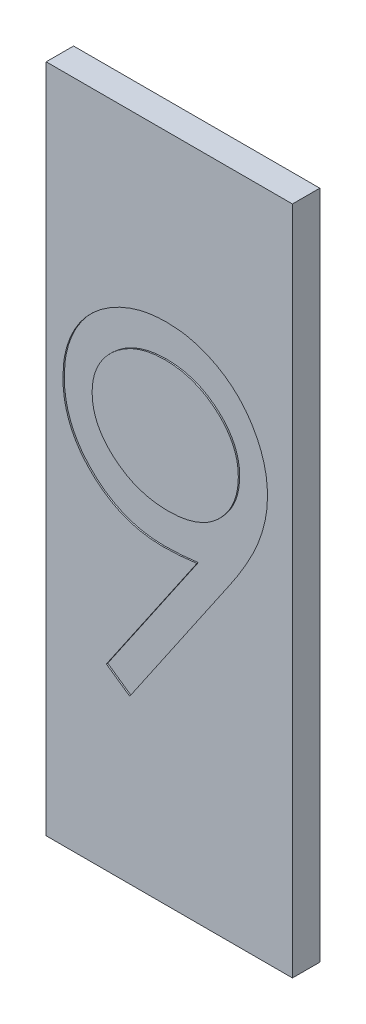
ISO-10303-21;
HEADER;
FILE_DESCRIPTION(('STEP AP214'),'2;1');
FILE_NAME('part.step','',(''),(''),'','','');
FILE_SCHEMA(('AUTOMOTIVE_DESIGN { 1 0 10303 214 1 1 1 1 }'));
ENDSEC;
DATA;
#1=APPLICATION_CONTEXT('core data for automotive mechanical design processes');
#2=APPLICATION_PROTOCOL_DEFINITION('international standard','automotive_design',2000,#1);
#3=PRODUCT_CONTEXT('',#1,'mechanical');
#4=PRODUCT('Part','Part','',(#3));
#5=PRODUCT_RELATED_PRODUCT_CATEGORY('part','',(#4));
#6=PRODUCT_DEFINITION_FORMATION('','',#4);
#7=PRODUCT_DEFINITION_CONTEXT('part definition',#1,'design');
#8=PRODUCT_DEFINITION('design','',#6,#7);
#9=PRODUCT_DEFINITION_SHAPE('','',#8);
#10=(LENGTH_UNIT() NAMED_UNIT(*) SI_UNIT(.MILLI.,.METRE.));
#11=(NAMED_UNIT(*) PLANE_ANGLE_UNIT() SI_UNIT($,.RADIAN.));
#12=(NAMED_UNIT(*) SI_UNIT($,.STERADIAN.) SOLID_ANGLE_UNIT());
#13=UNCERTAINTY_MEASURE_WITH_UNIT(LENGTH_MEASURE(1.E-05),#10,'distance_accuracy_value','');
#14=(GEOMETRIC_REPRESENTATION_CONTEXT(3) GLOBAL_UNCERTAINTY_ASSIGNED_CONTEXT((#13)) GLOBAL_UNIT_ASSIGNED_CONTEXT((#10,
#11,#12)) REPRESENTATION_CONTEXT('',''));
#15=CARTESIAN_POINT('',(0.,0.,0.));
#16=DIRECTION('',(0.,0.,1.));
#17=DIRECTION('',(1.,0.,0.));
#18=AXIS2_PLACEMENT_3D('',#15,#16,#17);
#19=CARTESIAN_POINT('',(0.,0.,2.));
#20=DIRECTION('',(0.,0.,1.));
#21=DIRECTION('',(1.,0.,0.));
#22=AXIS2_PLACEMENT_3D('',#19,#20,#21);
#23=PLANE('',#22);
#24=DIRECTION('',(0.,-1.,0.));
#25=VECTOR('',#24,1.);
#26=CARTESIAN_POINT('',(0.,0.,2.));
#27=LINE('',#26,#25);
#28=CARTESIAN_POINT('',(0.,49.,2.));
#29=VERTEX_POINT('',#28);
#30=CARTESIAN_POINT('',(0.,0.,2.));
#31=VERTEX_POINT('',#30);
#32=EDGE_CURVE('E282',#29,#31,#27,.T.);
#33=ORIENTED_EDGE('',*,*,#32,.T.);
#34=DIRECTION('',(1.,0.,0.));
#35=VECTOR('',#34,1.);
#36=CARTESIAN_POINT('',(18.,0.,2.));
#37=LINE('',#36,#35);
#38=CARTESIAN_POINT('',(18.,0.,2.));
#39=VERTEX_POINT('',#38);
#40=EDGE_CURVE('E285',#31,#39,#37,.T.);
#41=ORIENTED_EDGE('',*,*,#40,.T.);
#42=DIRECTION('',(0.,1.,0.));
#43=VECTOR('',#42,1.);
#44=CARTESIAN_POINT('',(18.,0.,2.));
#45=LINE('',#44,#43);
#46=CARTESIAN_POINT('',(18.,49.,2.));
#47=VERTEX_POINT('',#46);
#48=EDGE_CURVE('E288',#39,#47,#45,.T.);
#49=ORIENTED_EDGE('',*,*,#48,.T.);
#50=DIRECTION('',(-1.,0.,0.));
#51=VECTOR('',#50,1.);
#52=CARTESIAN_POINT('',(18.,49.,2.));
#53=LINE('',#52,#51);
#54=EDGE_CURVE('E290',#47,#29,#53,.T.);
#55=ORIENTED_EDGE('',*,*,#54,.T.);
#56=EDGE_LOOP('',(#33,#41,#49,#55));
#57=FACE_BOUND('',#56,.T.);
#58=CARTESIAN_POINT('',(16.1802884615385,29.6056941105769,2.));
#59=CARTESIAN_POINT('',(16.1722710723032,29.3557052661597,2.));
#60=CARTESIAN_POINT('',(16.156009803694,28.8486654269939,2.));
#61=CARTESIAN_POINT('',(16.0421431427276,28.0782947017078,2.));
#62=CARTESIAN_POINT('',(15.8487843826846,27.2928140153939,2.));
#63=CARTESIAN_POINT('',(15.6293576467429,26.6279581587378,2.));
#64=CARTESIAN_POINT('',(15.4175477202856,26.0788524557485,2.));
#65=CARTESIAN_POINT('',(15.2181953778545,25.645114027698,2.));
#66=CARTESIAN_POINT('',(14.9969966189874,25.1885857897114,2.));
#67=CARTESIAN_POINT('',(14.7390135895686,24.7140547942173,2.));
#68=CARTESIAN_POINT('',(14.461684392181,24.2154718331874,2.));
#69=CARTESIAN_POINT('',(14.1483168142711,23.697837641946,2.));
#70=CARTESIAN_POINT('',(13.8060592632779,23.1604575991892,2.));
#71=CARTESIAN_POINT('',(13.5622892059757,22.7981872323353,2.));
#72=CARTESIAN_POINT('',(13.4374624399038,22.6126802884615,2.));
#73=B_SPLINE_CURVE_WITH_KNOTS('',3,(#58,#59,#60,#61,#62,#63,#64,#65,#66,#67,#68,#69,#70,#71,
#72),.UNSPECIFIED.,.F.,.F.,(4,1,1,1,1,1,1,1,1,1,1,1,4),(0.,0.0983199739813471,0.199417473649668,
0.305602597602122,0.416162356355746,0.474582381314302,0.537006481233518,0.60385736064996,
0.674089607691874,0.749416986763792,0.82825348089081,0.912054159556053,1.),.UNSPECIFIED.);
#74=CARTESIAN_POINT('',(16.1802884615385,29.6056941105769,2.));
#75=VERTEX_POINT('',#74);
#76=CARTESIAN_POINT('',(13.4374624399038,22.6126802884615,2.));
#77=VERTEX_POINT('',#76);
#78=EDGE_CURVE('E254',#75,#77,#73,.T.);
#79=ORIENTED_EDGE('',*,*,#78,.T.);
#80=DIRECTION('',(-0.56440743436465,-0.825496364640035,0.));
#81=VECTOR('',#80,1.);
#82=CARTESIAN_POINT('',(13.4374624399038,22.6126802884615,2.));
#83=LINE('',#82,#81);
#84=CARTESIAN_POINT('',(6.10576923076923,11.8894230769231,2.));
#85=VERTEX_POINT('',#84);
#86=EDGE_CURVE('E48',#77,#85,#83,.T.);
#87=ORIENTED_EDGE('',*,*,#86,.T.);
#88=DIRECTION('',(-0.820951938640307,0.570997298104572,0.));
#89=VECTOR('',#88,1.);
#90=CARTESIAN_POINT('',(6.10576923076923,11.8894230769231,2.));
#91=LINE('',#90,#89);
#92=CARTESIAN_POINT('',(4.39806189903846,13.0771859975962,2.));
#93=VERTEX_POINT('',#92);
#94=EDGE_CURVE('E219',#85,#93,#91,.T.);
#95=ORIENTED_EDGE('',*,*,#94,.T.);
#96=DIRECTION('',(0.564610999945546,0.825357146174001,0.));
#97=VECTOR('',#96,1.);
#98=CARTESIAN_POINT('',(4.39806189903846,13.0771859975962,2.));
#99=LINE('',#98,#97);
#100=CARTESIAN_POINT('',(11.0190054086538,22.7557842548077,2.));
#101=VERTEX_POINT('',#100);
#102=EDGE_CURVE('E222',#93,#101,#99,.T.);
#103=ORIENTED_EDGE('',*,*,#102,.T.);
#104=CARTESIAN_POINT('',(11.0190054086538,22.7557842548077,2.));
#105=CARTESIAN_POINT('',(10.5965666539461,22.7041243061301,2.));
#106=CARTESIAN_POINT('',(9.76476119373004,22.6024029869906,2.));
#107=CARTESIAN_POINT('',(8.92698912427828,22.5837159254235,2.));
#108=CARTESIAN_POINT('',(8.51468599759616,22.5745192307692,2.));
#109=B_SPLINE_CURVE_WITH_KNOTS('',3,(#104,#105,#106,#107,#108),.UNSPECIFIED.,.F.,.F.,(4,1,4),
(0.,0.507857636084782,1.),.UNSPECIFIED.);
#110=CARTESIAN_POINT('',(8.51468599759616,22.5745192307692,2.));
#111=VERTEX_POINT('',#110);
#112=EDGE_CURVE('E225',#101,#111,#109,.T.);
#113=ORIENTED_EDGE('',*,*,#112,.T.);
#114=CARTESIAN_POINT('',(8.51468599759616,22.5745192307692,2.));
#115=CARTESIAN_POINT('',(8.26470885092438,22.5809219116985,2.));
#116=CARTESIAN_POINT('',(7.77402557197752,22.593489814462,2.));
#117=CARTESIAN_POINT('',(7.05263165015722,22.6931064030875,2.));
#118=CARTESIAN_POINT('',(6.35944596128278,22.8465278081036,2.));
#119=CARTESIAN_POINT('',(5.69630623625832,23.075459516578,2.));
#120=CARTESIAN_POINT('',(5.06071996207075,23.3599726887237,2.));
#121=CARTESIAN_POINT('',(4.45407466216267,23.7127855851378,2.));
#122=CARTESIAN_POINT('',(3.87718697853681,24.1278462474523,2.));
#123=CARTESIAN_POINT('',(3.33625263577882,24.6029599933916,2.));
#124=CARTESIAN_POINT('',(2.84427455510668,25.1246446004364,2.));
#125=CARTESIAN_POINT('',(2.4059660471136,25.6767928137997,2.));
#126=CARTESIAN_POINT('',(2.04169513142359,26.2658186142653,2.));
#127=CARTESIAN_POINT('',(1.7390955059714,26.8797063580111,2.));
#128=CARTESIAN_POINT('',(1.50960795570085,27.5272794771853,2.));
#129=CARTESIAN_POINT('',(1.34249497673811,28.2011691460062,2.));
#130=CARTESIAN_POINT('',(1.2396089586094,28.9060983530712,2.));
#131=CARTESIAN_POINT('',(1.22736868365055,29.385921117768,2.));
#132=CARTESIAN_POINT('',(1.22115384615385,29.6295447716346,2.));
#133=B_SPLINE_CURVE_WITH_KNOTS('',3,(#114,#115,#116,#117,#118,#119,#120,#121,#122,#123,#124,
#125,#126,#127,#128,#129,#130,#131,#132),.UNSPECIFIED.,.F.,.F.,(4,1,1,1,1,1,1,1,1,1,1,1,1,1,1,1,
4),(0.,0.066294912801988,0.130131116481168,0.192862225172608,0.254360004204222,
0.315909846081327,0.377338139346353,0.440205262887928,0.504175131770896,0.56803363241327,
0.630227721766869,0.690861477407067,0.751421817648455,0.811465736740862,0.872750466796127,
0.935390734844466,1.),.UNSPECIFIED.);
#134=CARTESIAN_POINT('',(1.22115384615385,29.6295447716346,2.));
#135=VERTEX_POINT('',#134);
#136=EDGE_CURVE('E230',#111,#135,#133,.T.);
#137=ORIENTED_EDGE('',*,*,#136,.T.);
#138=CARTESIAN_POINT('',(1.22115384615385,29.6295447716346,2.));
#139=CARTESIAN_POINT('',(1.23295419710314,29.9627064981754,2.));
#140=CARTESIAN_POINT('',(1.25611589221238,30.6166353826096,2.));
#141=CARTESIAN_POINT('',(1.44252366143025,31.5720865609943,2.));
#142=CARTESIAN_POINT('',(1.74909489774522,32.4755092952494,2.));
#143=CARTESIAN_POINT('',(2.17655224680987,33.3245282931901,2.));
#144=CARTESIAN_POINT('',(2.71495097654141,34.1069304296688,2.));
#145=CARTESIAN_POINT('',(3.36202906316126,34.8118390024216,2.));
#146=CARTESIAN_POINT('',(4.11385067732807,35.42922809734,2.));
#147=CARTESIAN_POINT('',(4.95328905745801,35.9599344097621,2.));
#148=CARTESIAN_POINT('',(5.86056585946546,36.3867564447482,2.));
#149=CARTESIAN_POINT('',(6.8108115510297,36.7013488284183,2.));
#150=CARTESIAN_POINT('',(7.79674511793427,36.8863974522937,2.));
#151=CARTESIAN_POINT('',(8.46463587378312,36.9107941145853,2.));
#152=CARTESIAN_POINT('',(8.80089393028846,36.9230769230769,2.));
#153=B_SPLINE_CURVE_WITH_KNOTS('',3,(#138,#139,#140,#141,#142,#143,#144,#145,#146,#147,#148,
#149,#150,#151,#152),.UNSPECIFIED.,.F.,.F.,(4,1,1,1,1,1,1,1,1,1,1,1,4),(0.,0.0852490510097896,
0.167326593617821,0.248175324580851,0.328829078311602,0.409908096976769,0.490584451140796,
0.57299348718939,0.658264892488035,0.744221577307991,0.82906040699134,0.913938297810617,1.),.UNSPECIFIED.);
#154=CARTESIAN_POINT('',(8.80089393028846,36.9230769230769,2.));
#155=VERTEX_POINT('',#154);
#156=EDGE_CURVE('E238',#135,#155,#153,.T.);
#157=ORIENTED_EDGE('',*,*,#156,.T.);
#158=CARTESIAN_POINT('',(8.80089393028846,36.9230769230769,2.));
#159=CARTESIAN_POINT('',(9.13078835646244,36.9106252779937,2.));
#160=CARTESIAN_POINT('',(9.7826286481837,36.8860220009466,2.));
#161=CARTESIAN_POINT('',(10.7411770678918,36.7058364256136,2.));
#162=CARTESIAN_POINT('',(11.6592579153181,36.4021476338523,2.));
#163=CARTESIAN_POINT('',(12.5317818426308,35.9824722983923,2.));
#164=CARTESIAN_POINT('',(13.3396339151321,35.4564139798761,2.));
#165=CARTESIAN_POINT('',(14.0660907735046,34.8295701666475,2.));
#166=CARTESIAN_POINT('',(14.6945743519868,34.1015504189011,2.));
#167=CARTESIAN_POINT('',(15.2240546834216,33.2899626562687,2.));
#168=CARTESIAN_POINT('',(15.6490740646802,32.4179694449235,2.));
#169=CARTESIAN_POINT('',(15.9557265614253,31.5077609721887,2.));
#170=CARTESIAN_POINT('',(16.1444959981539,30.5658832433786,2.));
#171=CARTESIAN_POINT('',(16.1682835092686,29.9277458393316,2.));
#172=CARTESIAN_POINT('',(16.1802884615385,29.6056941105769,2.));
#173=B_SPLINE_CURVE_WITH_KNOTS('',3,(#158,#159,#160,#161,#162,#163,#164,#165,#166,#167,#168,
#169,#170,#171,#172),.UNSPECIFIED.,.F.,.F.,(4,1,1,1,1,1,1,1,1,1,1,1,4),(0.,0.0855321076772636,
0.169003382889767,0.251943248891639,0.335682010401451,0.419408585819298,0.501264898481744,
0.583702941604284,0.668000359044251,0.751918659862066,0.834597711258477,0.916525668780153,1.),.UNSPECIFIED.);
#174=EDGE_CURVE('E246',#155,#75,#173,.T.);
#175=ORIENTED_EDGE('',*,*,#174,.T.);
#176=EDGE_LOOP('',(#79,#87,#95,#103,#113,#137,#157,#175));
#177=FACE_BOUND('',#176,.T.);
#178=ADVANCED_FACE('F33',(#57,#177),#23,.T.);
#179=CARTESIAN_POINT('',(0.,0.,2.));
#180=DIRECTION('',(1.,0.,0.));
#181=DIRECTION('',(0.,0.,-1.));
#182=AXIS2_PLACEMENT_3D('',#179,#180,#181);
#183=PLANE('',#182);
#184=DIRECTION('',(0.,-1.,0.));
#185=VECTOR('',#184,1.);
#186=CARTESIAN_POINT('',(0.,0.,0.));
#187=LINE('',#186,#185);
#188=CARTESIAN_POINT('',(0.,49.,0.));
#189=VERTEX_POINT('',#188);
#190=CARTESIAN_POINT('',(0.,0.,0.));
#191=VERTEX_POINT('',#190);
#192=EDGE_CURVE('E281',#189,#191,#187,.T.);
#193=ORIENTED_EDGE('',*,*,#192,.T.);
#194=DIRECTION('',(0.,0.,-1.));
#195=VECTOR('',#194,1.);
#196=CARTESIAN_POINT('',(0.,0.,2.));
#197=LINE('',#196,#195);
#198=EDGE_CURVE('E11',#31,#191,#197,.T.);
#199=ORIENTED_EDGE('',*,*,#198,.F.);
#200=ORIENTED_EDGE('',*,*,#32,.F.);
#201=DIRECTION('',(0.,0.,-1.));
#202=VECTOR('',#201,1.);
#203=CARTESIAN_POINT('',(0.,49.,2.));
#204=LINE('',#203,#202);
#205=EDGE_CURVE('E292',#29,#189,#204,.T.);
#206=ORIENTED_EDGE('',*,*,#205,.T.);
#207=EDGE_LOOP('',(#193,#199,#200,#206));
#208=FACE_BOUND('',#207,.T.);
#209=ADVANCED_FACE('F35',(#208),#183,.F.);
#210=CARTESIAN_POINT('',(18.,0.,2.));
#211=DIRECTION('',(0.,1.,0.));
#212=DIRECTION('',(0.,0.,1.));
#213=AXIS2_PLACEMENT_3D('',#210,#211,#212);
#214=PLANE('',#213);
#215=DIRECTION('',(1.,0.,0.));
#216=VECTOR('',#215,1.);
#217=CARTESIAN_POINT('',(18.,0.,0.));
#218=LINE('',#217,#216);
#219=CARTESIAN_POINT('',(18.,0.,0.));
#220=VERTEX_POINT('',#219);
#221=EDGE_CURVE('E295',#191,#220,#218,.T.);
#222=ORIENTED_EDGE('',*,*,#221,.T.);
#223=DIRECTION('',(0.,0.,-1.));
#224=VECTOR('',#223,1.);
#225=CARTESIAN_POINT('',(18.,0.,2.));
#226=LINE('',#225,#224);
#227=EDGE_CURVE('E41',#39,#220,#226,.T.);
#228=ORIENTED_EDGE('',*,*,#227,.F.);
#229=ORIENTED_EDGE('',*,*,#40,.F.);
#230=ORIENTED_EDGE('',*,*,#198,.T.);
#231=EDGE_LOOP('',(#222,#228,#229,#230));
#232=FACE_BOUND('',#231,.T.);
#233=ADVANCED_FACE('F325',(#232),#214,.F.);
#234=CARTESIAN_POINT('',(18.,0.,2.));
#235=DIRECTION('',(-1.,0.,0.));
#236=DIRECTION('',(0.,0.,1.));
#237=AXIS2_PLACEMENT_3D('',#234,#235,#236);
#238=PLANE('',#237);
#239=DIRECTION('',(0.,1.,0.));
#240=VECTOR('',#239,1.);
#241=CARTESIAN_POINT('',(18.,0.,0.));
#242=LINE('',#241,#240);
#243=CARTESIAN_POINT('',(18.,49.,0.));
#244=VERTEX_POINT('',#243);
#245=EDGE_CURVE('E297',#220,#244,#242,.T.);
#246=ORIENTED_EDGE('',*,*,#245,.T.);
#247=DIRECTION('',(0.,0.,-1.));
#248=VECTOR('',#247,1.);
#249=CARTESIAN_POINT('',(18.,49.,2.));
#250=LINE('',#249,#248);
#251=EDGE_CURVE('E302',#47,#244,#250,.T.);
#252=ORIENTED_EDGE('',*,*,#251,.F.);
#253=ORIENTED_EDGE('',*,*,#48,.F.);
#254=ORIENTED_EDGE('',*,*,#227,.T.);
#255=EDGE_LOOP('',(#246,#252,#253,#254));
#256=FACE_BOUND('',#255,.T.);
#257=ADVANCED_FACE('F309',(#256),#238,.F.);
#258=CARTESIAN_POINT('',(18.,49.,2.));
#259=DIRECTION('',(0.,-1.,0.));
#260=DIRECTION('',(0.,0.,-1.));
#261=AXIS2_PLACEMENT_3D('',#258,#259,#260);
#262=PLANE('',#261);
#263=DIRECTION('',(-1.,0.,0.));
#264=VECTOR('',#263,1.);
#265=CARTESIAN_POINT('',(18.,49.,0.));
#266=LINE('',#265,#264);
#267=EDGE_CURVE('E286',#244,#189,#266,.T.);
#268=ORIENTED_EDGE('',*,*,#267,.T.);
#269=ORIENTED_EDGE('',*,*,#205,.F.);
#270=ORIENTED_EDGE('',*,*,#54,.F.);
#271=ORIENTED_EDGE('',*,*,#251,.T.);
#272=EDGE_LOOP('',(#268,#269,#270,#271));
#273=FACE_BOUND('',#272,.T.);
#274=ADVANCED_FACE('F318',(#273),#262,.F.);
#275=CARTESIAN_POINT('',(0.,0.,0.));
#276=DIRECTION('',(0.,0.,1.));
#277=DIRECTION('',(1.,0.,0.));
#278=AXIS2_PLACEMENT_3D('',#275,#276,#277);
#279=PLANE('',#278);
#280=ORIENTED_EDGE('',*,*,#192,.F.);
#281=ORIENTED_EDGE('',*,*,#267,.F.);
#282=ORIENTED_EDGE('',*,*,#245,.F.);
#283=ORIENTED_EDGE('',*,*,#221,.F.);
#284=EDGE_LOOP('',(#280,#281,#282,#283));
#285=FACE_BOUND('',#284,.T.);
#286=ADVANCED_FACE('F315',(#285),#279,.F.);
#287=CARTESIAN_POINT('',(13.4374624399038,22.6126802884615,1.9));
#288=DIRECTION('',(-0.825496364640035,0.56440743436465,0.));
#289=DIRECTION('',(-0.56440743436465,-0.825496364640035,0.));
#290=AXIS2_PLACEMENT_3D('',#287,#288,#289);
#291=PLANE('',#290);
#292=ORIENTED_EDGE('',*,*,#86,.F.);
#293=DIRECTION('',(0.,0.,1.));
#294=VECTOR('',#293,1.);
#295=CARTESIAN_POINT('',(13.4374624399038,22.6126802884615,1.9));
#296=LINE('',#295,#294);
#297=CARTESIAN_POINT('',(13.4374624399038,22.6126802884615,1.9));
#298=VERTEX_POINT('',#297);
#299=EDGE_CURVE('E209',#298,#77,#296,.T.);
#300=ORIENTED_EDGE('',*,*,#299,.F.);
#301=DIRECTION('',(-0.56440743436465,-0.825496364640035,0.));
#302=VECTOR('',#301,1.);
#303=CARTESIAN_POINT('',(13.4374624399038,22.6126802884615,1.9));
#304=LINE('',#303,#302);
#305=CARTESIAN_POINT('',(6.10576923076923,11.8894230769231,1.9));
#306=VERTEX_POINT('',#305);
#307=EDGE_CURVE('E262',#298,#306,#304,.T.);
#308=ORIENTED_EDGE('',*,*,#307,.T.);
#309=DIRECTION('',(0.,0.,1.));
#310=VECTOR('',#309,1.);
#311=CARTESIAN_POINT('',(6.10576923076923,11.8894230769231,1.9));
#312=LINE('',#311,#310);
#313=EDGE_CURVE('E279',#306,#85,#312,.T.);
#314=ORIENTED_EDGE('',*,*,#313,.T.);
#315=EDGE_LOOP('',(#292,#300,#308,#314));
#316=FACE_BOUND('',#315,.T.);
#317=ADVANCED_FACE('F411',(#316),#291,.T.);
#318=CARTESIAN_POINT('',(6.10576923076923,11.8894230769231,1.9));
#319=DIRECTION('',(0.570997298104572,0.820951938640307,0.));
#320=DIRECTION('',(-0.820951938640307,0.570997298104572,0.));
#321=AXIS2_PLACEMENT_3D('',#318,#319,#320);
#322=PLANE('',#321);
#323=ORIENTED_EDGE('',*,*,#94,.F.);
#324=ORIENTED_EDGE('',*,*,#313,.F.);
#325=DIRECTION('',(-0.820951938640307,0.570997298104572,0.));
#326=VECTOR('',#325,1.);
#327=CARTESIAN_POINT('',(6.10576923076923,11.8894230769231,1.9));
#328=LINE('',#327,#326);
#329=CARTESIAN_POINT('',(4.39806189903846,13.0771859975962,1.9));
#330=VERTEX_POINT('',#329);
#331=EDGE_CURVE('E382',#306,#330,#328,.T.);
#332=ORIENTED_EDGE('',*,*,#331,.T.);
#333=DIRECTION('',(0.,0.,1.));
#334=VECTOR('',#333,1.);
#335=CARTESIAN_POINT('',(4.39806189903846,13.0771859975962,1.9));
#336=LINE('',#335,#334);
#337=EDGE_CURVE('E277',#330,#93,#336,.T.);
#338=ORIENTED_EDGE('',*,*,#337,.T.);
#339=EDGE_LOOP('',(#323,#324,#332,#338));
#340=FACE_BOUND('',#339,.T.);
#341=ADVANCED_FACE('F408',(#340),#322,.T.);
#342=CARTESIAN_POINT('',(4.39806189903846,13.0771859975962,1.9));
#343=DIRECTION('',(0.825357146174001,-0.564610999945546,0.));
#344=DIRECTION('',(0.564610999945546,0.825357146174001,0.));
#345=AXIS2_PLACEMENT_3D('',#342,#343,#344);
#346=PLANE('',#345);
#347=ORIENTED_EDGE('',*,*,#102,.F.);
#348=ORIENTED_EDGE('',*,*,#337,.F.);
#349=DIRECTION('',(0.564610999945546,0.825357146174001,0.));
#350=VECTOR('',#349,1.);
#351=CARTESIAN_POINT('',(4.39806189903846,13.0771859975962,1.9));
#352=LINE('',#351,#350);
#353=CARTESIAN_POINT('',(11.0190054086538,22.7557842548077,1.9));
#354=VERTEX_POINT('',#353);
#355=EDGE_CURVE('E384',#330,#354,#352,.T.);
#356=ORIENTED_EDGE('',*,*,#355,.T.);
#357=DIRECTION('',(0.,0.,1.));
#358=VECTOR('',#357,1.);
#359=CARTESIAN_POINT('',(11.0190054086538,22.7557842548077,1.9));
#360=LINE('',#359,#358);
#361=EDGE_CURVE('E275',#354,#101,#360,.T.);
#362=ORIENTED_EDGE('',*,*,#361,.T.);
#363=EDGE_LOOP('',(#347,#348,#356,#362));
#364=FACE_BOUND('',#363,.T.);
#365=ADVANCED_FACE('F404',(#364),#346,.T.);
#366=CARTESIAN_POINT('',(11.0190054086538,22.7557842548077,1.9));
#367=CARTESIAN_POINT('',(10.5965666539461,22.7041243061301,1.9));
#368=CARTESIAN_POINT('',(9.76476119373004,22.6024029869906,1.9));
#369=CARTESIAN_POINT('',(8.92698912427828,22.5837159254235,1.9));
#370=CARTESIAN_POINT('',(8.51468599759616,22.5745192307692,1.9));
#371=B_SPLINE_CURVE_WITH_KNOTS('',3,(#366,#367,#368,#369,#370),.UNSPECIFIED.,.F.,.F.,(4,1,4),
(0.,0.507857636084782,1.),.UNSPECIFIED.);
#372=DIRECTION('',(0.,0.,1.));
#373=VECTOR('',#372,1.);
#374=SURFACE_OF_LINEAR_EXTRUSION('',#371,#373);
#375=ORIENTED_EDGE('',*,*,#112,.F.);
#376=ORIENTED_EDGE('',*,*,#361,.F.);
#377=CARTESIAN_POINT('',(8.51468599759616,22.5745192307692,1.9));
#378=VERTEX_POINT('',#377);
#379=EDGE_CURVE('E386',#354,#378,#371,.T.);
#380=ORIENTED_EDGE('',*,*,#379,.T.);
#381=DIRECTION('',(0.,0.,1.));
#382=VECTOR('',#381,1.);
#383=CARTESIAN_POINT('',(8.51468599759616,22.5745192307692,1.9));
#384=LINE('',#383,#382);
#385=EDGE_CURVE('E273',#378,#111,#384,.T.);
#386=ORIENTED_EDGE('',*,*,#385,.T.);
#387=EDGE_LOOP('',(#375,#376,#380,#386));
#388=FACE_BOUND('',#387,.T.);
#389=ADVANCED_FACE('F399',(#388),#374,.T.);
#390=CARTESIAN_POINT('',(8.51468599759616,22.5745192307692,1.9));
#391=CARTESIAN_POINT('',(8.26470885092438,22.5809219116985,1.9));
#392=CARTESIAN_POINT('',(7.77402557197752,22.593489814462,1.9));
#393=CARTESIAN_POINT('',(7.05263165015722,22.6931064030875,1.9));
#394=CARTESIAN_POINT('',(6.35944596128278,22.8465278081036,1.9));
#395=CARTESIAN_POINT('',(5.69630623625832,23.075459516578,1.9));
#396=CARTESIAN_POINT('',(5.06071996207075,23.3599726887237,1.9));
#397=CARTESIAN_POINT('',(4.45407466216267,23.7127855851378,1.9));
#398=CARTESIAN_POINT('',(3.87718697853681,24.1278462474523,1.9));
#399=CARTESIAN_POINT('',(3.33625263577882,24.6029599933916,1.9));
#400=CARTESIAN_POINT('',(2.84427455510668,25.1246446004364,1.9));
#401=CARTESIAN_POINT('',(2.4059660471136,25.6767928137997,1.9));
#402=CARTESIAN_POINT('',(2.04169513142359,26.2658186142653,1.9));
#403=CARTESIAN_POINT('',(1.7390955059714,26.8797063580111,1.9));
#404=CARTESIAN_POINT('',(1.50960795570085,27.5272794771853,1.9));
#405=CARTESIAN_POINT('',(1.34249497673811,28.2011691460062,1.9));
#406=CARTESIAN_POINT('',(1.2396089586094,28.9060983530712,1.9));
#407=CARTESIAN_POINT('',(1.22736868365055,29.385921117768,1.9));
#408=CARTESIAN_POINT('',(1.22115384615385,29.6295447716346,1.9));
#409=B_SPLINE_CURVE_WITH_KNOTS('',3,(#390,#391,#392,#393,#394,#395,#396,#397,#398,#399,#400,
#401,#402,#403,#404,#405,#406,#407,#408),.UNSPECIFIED.,.F.,.F.,(4,1,1,1,1,1,1,1,1,1,1,1,1,1,1,1,
4),(0.,0.066294912801988,0.130131116481168,0.192862225172608,0.254360004204222,
0.315909846081327,0.377338139346353,0.440205262887928,0.504175131770896,0.56803363241327,
0.630227721766869,0.690861477407067,0.751421817648455,0.811465736740862,0.872750466796127,
0.935390734844466,1.),.UNSPECIFIED.);
#410=DIRECTION('',(0.,0.,1.));
#411=VECTOR('',#410,1.);
#412=SURFACE_OF_LINEAR_EXTRUSION('',#409,#411);
#413=ORIENTED_EDGE('',*,*,#136,.F.);
#414=ORIENTED_EDGE('',*,*,#385,.F.);
#415=CARTESIAN_POINT('',(1.22115384615385,29.6295447716346,1.9));
#416=VERTEX_POINT('',#415);
#417=EDGE_CURVE('E391',#378,#416,#409,.T.);
#418=ORIENTED_EDGE('',*,*,#417,.T.);
#419=DIRECTION('',(0.,0.,1.));
#420=VECTOR('',#419,1.);
#421=CARTESIAN_POINT('',(1.22115384615385,29.6295447716346,1.9));
#422=LINE('',#421,#420);
#423=EDGE_CURVE('E271',#416,#135,#422,.T.);
#424=ORIENTED_EDGE('',*,*,#423,.T.);
#425=EDGE_LOOP('',(#413,#414,#418,#424));
#426=FACE_BOUND('',#425,.T.);
#427=ADVANCED_FACE('F403',(#426),#412,.T.);
#428=CARTESIAN_POINT('',(1.22115384615385,29.6295447716346,1.9));
#429=CARTESIAN_POINT('',(1.23295419710314,29.9627064981754,1.9));
#430=CARTESIAN_POINT('',(1.25611589221238,30.6166353826096,1.9));
#431=CARTESIAN_POINT('',(1.44252366143025,31.5720865609943,1.9));
#432=CARTESIAN_POINT('',(1.74909489774522,32.4755092952494,1.9));
#433=CARTESIAN_POINT('',(2.17655224680987,33.3245282931901,1.9));
#434=CARTESIAN_POINT('',(2.71495097654141,34.1069304296688,1.9));
#435=CARTESIAN_POINT('',(3.36202906316126,34.8118390024216,1.9));
#436=CARTESIAN_POINT('',(4.11385067732807,35.42922809734,1.9));
#437=CARTESIAN_POINT('',(4.95328905745801,35.9599344097621,1.9));
#438=CARTESIAN_POINT('',(5.86056585946546,36.3867564447482,1.9));
#439=CARTESIAN_POINT('',(6.8108115510297,36.7013488284183,1.9));
#440=CARTESIAN_POINT('',(7.79674511793427,36.8863974522937,1.9));
#441=CARTESIAN_POINT('',(8.46463587378312,36.9107941145853,1.9));
#442=CARTESIAN_POINT('',(8.80089393028846,36.9230769230769,1.9));
#443=B_SPLINE_CURVE_WITH_KNOTS('',3,(#428,#429,#430,#431,#432,#433,#434,#435,#436,#437,#438,
#439,#440,#441,#442),.UNSPECIFIED.,.F.,.F.,(4,1,1,1,1,1,1,1,1,1,1,1,4),(0.,0.0852490510097896,
0.167326593617821,0.248175324580851,0.328829078311602,0.409908096976769,0.490584451140796,
0.57299348718939,0.658264892488035,0.744221577307991,0.82906040699134,0.913938297810617,1.),.UNSPECIFIED.);
#444=DIRECTION('',(0.,0.,1.));
#445=VECTOR('',#444,1.);
#446=SURFACE_OF_LINEAR_EXTRUSION('',#443,#445);
#447=ORIENTED_EDGE('',*,*,#156,.F.);
#448=ORIENTED_EDGE('',*,*,#423,.F.);
#449=CARTESIAN_POINT('',(8.80089393028846,36.9230769230769,1.9));
#450=VERTEX_POINT('',#449);
#451=EDGE_CURVE('E559',#416,#450,#443,.T.);
#452=ORIENTED_EDGE('',*,*,#451,.T.);
#453=DIRECTION('',(0.,0.,1.));
#454=VECTOR('',#453,1.);
#455=CARTESIAN_POINT('',(8.80089393028846,36.9230769230769,1.9));
#456=LINE('',#455,#454);
#457=EDGE_CURVE('E269',#450,#155,#456,.T.);
#458=ORIENTED_EDGE('',*,*,#457,.T.);
#459=EDGE_LOOP('',(#447,#448,#452,#458));
#460=FACE_BOUND('',#459,.T.);
#461=ADVANCED_FACE('F481',(#460),#446,.T.);
#462=CARTESIAN_POINT('',(8.80089393028846,36.9230769230769,1.9));
#463=CARTESIAN_POINT('',(9.13078835646244,36.9106252779937,1.9));
#464=CARTESIAN_POINT('',(9.7826286481837,36.8860220009466,1.9));
#465=CARTESIAN_POINT('',(10.7411770678918,36.7058364256136,1.9));
#466=CARTESIAN_POINT('',(11.6592579153181,36.4021476338523,1.9));
#467=CARTESIAN_POINT('',(12.5317818426308,35.9824722983923,1.9));
#468=CARTESIAN_POINT('',(13.3396339151321,35.4564139798761,1.9));
#469=CARTESIAN_POINT('',(14.0660907735046,34.8295701666475,1.9));
#470=CARTESIAN_POINT('',(14.6945743519868,34.1015504189011,1.9));
#471=CARTESIAN_POINT('',(15.2240546834216,33.2899626562687,1.9));
#472=CARTESIAN_POINT('',(15.6490740646802,32.4179694449235,1.9));
#473=CARTESIAN_POINT('',(15.9557265614253,31.5077609721887,1.9));
#474=CARTESIAN_POINT('',(16.1444959981539,30.5658832433786,1.9));
#475=CARTESIAN_POINT('',(16.1682835092686,29.9277458393316,1.9));
#476=CARTESIAN_POINT('',(16.1802884615385,29.6056941105769,1.9));
#477=B_SPLINE_CURVE_WITH_KNOTS('',3,(#462,#463,#464,#465,#466,#467,#468,#469,#470,#471,#472,
#473,#474,#475,#476),.UNSPECIFIED.,.F.,.F.,(4,1,1,1,1,1,1,1,1,1,1,1,4),(0.,0.0855321076772636,
0.169003382889767,0.251943248891639,0.335682010401451,0.419408585819298,0.501264898481744,
0.583702941604284,0.668000359044251,0.751918659862066,0.834597711258477,0.916525668780153,1.),.UNSPECIFIED.);
#478=DIRECTION('',(0.,0.,1.));
#479=VECTOR('',#478,1.);
#480=SURFACE_OF_LINEAR_EXTRUSION('',#477,#479);
#481=ORIENTED_EDGE('',*,*,#174,.F.);
#482=ORIENTED_EDGE('',*,*,#457,.F.);
#483=CARTESIAN_POINT('',(16.1802884615385,29.6056941105769,1.9));
#484=VERTEX_POINT('',#483);
#485=EDGE_CURVE('E210',#450,#484,#477,.T.);
#486=ORIENTED_EDGE('',*,*,#485,.T.);
#487=DIRECTION('',(0.,0.,1.));
#488=VECTOR('',#487,1.);
#489=CARTESIAN_POINT('',(16.1802884615385,29.6056941105769,1.9));
#490=LINE('',#489,#488);
#491=EDGE_CURVE('E267',#484,#75,#490,.T.);
#492=ORIENTED_EDGE('',*,*,#491,.T.);
#493=EDGE_LOOP('',(#481,#482,#486,#492));
#494=FACE_BOUND('',#493,.T.);
#495=ADVANCED_FACE('F200',(#494),#480,.T.);
#496=CARTESIAN_POINT('',(16.1802884615385,29.6056941105769,1.9));
#497=CARTESIAN_POINT('',(16.1722710723032,29.3557052661597,1.9));
#498=CARTESIAN_POINT('',(16.156009803694,28.8486654269939,1.9));
#499=CARTESIAN_POINT('',(16.0421431427276,28.0782947017078,1.9));
#500=CARTESIAN_POINT('',(15.8487843826846,27.2928140153939,1.9));
#501=CARTESIAN_POINT('',(15.6293576467429,26.6279581587378,1.9));
#502=CARTESIAN_POINT('',(15.4175477202856,26.0788524557485,1.9));
#503=CARTESIAN_POINT('',(15.2181953778545,25.645114027698,1.9));
#504=CARTESIAN_POINT('',(14.9969966189874,25.1885857897114,1.9));
#505=CARTESIAN_POINT('',(14.7390135895686,24.7140547942173,1.9));
#506=CARTESIAN_POINT('',(14.461684392181,24.2154718331874,1.9));
#507=CARTESIAN_POINT('',(14.1483168142711,23.697837641946,1.9));
#508=CARTESIAN_POINT('',(13.8060592632779,23.1604575991892,1.9));
#509=CARTESIAN_POINT('',(13.5622892059757,22.7981872323353,1.9));
#510=CARTESIAN_POINT('',(13.4374624399038,22.6126802884615,1.9));
#511=B_SPLINE_CURVE_WITH_KNOTS('',3,(#496,#497,#498,#499,#500,#501,#502,#503,#504,#505,#506,
#507,#508,#509,#510),.UNSPECIFIED.,.F.,.F.,(4,1,1,1,1,1,1,1,1,1,1,1,4),(0.,0.0983199739813471,
0.199417473649668,0.305602597602122,0.416162356355746,0.474582381314302,0.537006481233518,
0.60385736064996,0.674089607691874,0.749416986763792,0.82825348089081,0.912054159556053,1.),.UNSPECIFIED.);
#512=DIRECTION('',(0.,0.,1.));
#513=VECTOR('',#512,1.);
#514=SURFACE_OF_LINEAR_EXTRUSION('',#511,#513);
#515=ORIENTED_EDGE('',*,*,#78,.F.);
#516=ORIENTED_EDGE('',*,*,#491,.F.);
#517=EDGE_CURVE('E204',#484,#298,#511,.T.);
#518=ORIENTED_EDGE('',*,*,#517,.T.);
#519=ORIENTED_EDGE('',*,*,#299,.T.);
#520=EDGE_LOOP('',(#515,#516,#518,#519));
#521=FACE_BOUND('',#520,.T.);
#522=ADVANCED_FACE('F196',(#521),#514,.T.);
#523=CARTESIAN_POINT('',(9.76982864504963,22.6236396614188,1.9));
#524=DIRECTION('',(0.,0.,1.));
#525=DIRECTION('',(0.,-1.,0.));
#526=AXIS2_PLACEMENT_3D('',#523,#524,#525);
#527=PLANE('',#526);
#528=CARTESIAN_POINT('',(8.69118088942308,34.4807692307692,1.9));
#529=CARTESIAN_POINT('',(8.50976941744698,34.4754840009346,1.9));
#530=CARTESIAN_POINT('',(8.15384160348614,34.4651144235269,1.9));
#531=CARTESIAN_POINT('',(7.62953009019295,34.4042142597648,1.9));
#532=CARTESIAN_POINT('',(7.12701035898665,34.2930201975267,1.9));
#533=CARTESIAN_POINT('',(6.64299326390072,34.1404006885125,1.9));
#534=CARTESIAN_POINT('',(6.17838784395632,33.9436987457865,1.9));
#535=CARTESIAN_POINT('',(5.73362591100587,33.7054317169497,1.9));
#536=CARTESIAN_POINT('',(5.31129410082189,33.4212150905877,1.9));
#537=CARTESIAN_POINT('',(4.91547101832289,33.098761370863,1.9));
#538=CARTESIAN_POINT('',(4.54741194137297,32.7511829213095,1.9));
#539=CARTESIAN_POINT('',(4.23359361010298,32.371724413935,1.9));
#540=CARTESIAN_POINT('',(3.96421373736529,31.979515363524,1.9));
#541=CARTESIAN_POINT('',(3.74054630740462,31.569814441493,1.9));
#542=CARTESIAN_POINT('',(3.57043989524208,31.1399220341151,1.9));
#543=CARTESIAN_POINT('',(3.44374377703783,30.6929547636142,1.9));
#544=CARTESIAN_POINT('',(3.37170643844549,30.2265766765915,1.9));
#545=CARTESIAN_POINT('',(3.36272880919336,29.9096325732865,1.9));
#546=CARTESIAN_POINT('',(3.35817307692308,29.7487980769231,1.9));
#547=B_SPLINE_CURVE_WITH_KNOTS('',3,(#528,#529,#530,#531,#532,#533,#534,#535,#536,#537,#538,
#539,#540,#541,#542,#543,#544,#545,#546),.UNSPECIFIED.,.F.,.F.,(4,1,1,1,1,1,1,1,1,1,1,1,1,1,1,1,
4),(0.,0.0687118407239282,0.134812065608048,0.19953759260799,0.263334935107978,
0.326747480565382,0.390328483069277,0.454125825569265,0.519203321691314,0.58351014529212,
0.645497182764503,0.705289842311449,0.763487579584355,0.821856400128069,0.880004273206515,
0.939107709897902,1.),.UNSPECIFIED.);
#548=CARTESIAN_POINT('',(8.69118088942308,34.4807692307692,1.9));
#549=VERTEX_POINT('',#548);
#550=CARTESIAN_POINT('',(3.35817307692308,29.7487980769231,1.9));
#551=VERTEX_POINT('',#550);
#552=EDGE_CURVE('E160',#549,#551,#547,.T.);
#553=ORIENTED_EDGE('',*,*,#552,.F.);
#554=CARTESIAN_POINT('',(14.0432692307692,29.7487980769231,1.9));
#555=CARTESIAN_POINT('',(14.0387130887018,29.9096322277981,1.9));
#556=CARTESIAN_POINT('',(14.0297346518941,30.2265756502758,1.9));
#557=CARTESIAN_POINT('',(13.9577032020574,30.6929587019426,1.9));
#558=CARTESIAN_POINT('',(13.8309851661679,31.1399074942598,1.9));
#559=CARTESIAN_POINT('',(13.6609606185695,31.5698689193479,1.9));
#560=CARTESIAN_POINT('',(13.4369854289516,31.9793103778733,1.9));
#561=CARTESIAN_POINT('',(13.168220642082,32.373372362958,1.9));
#562=CARTESIAN_POINT('',(12.8489123676155,32.7495563036019,1.9));
#563=CARTESIAN_POINT('',(12.4815020514394,33.0990148348197,1.9));
#564=CARTESIAN_POINT('',(12.0852991104514,33.4211496492291,1.9));
#565=CARTESIAN_POINT('',(11.6630660642096,33.7054442016978,1.9));
#566=CARTESIAN_POINT('',(11.2182831533954,33.9437134128535,1.9));
#567=CARTESIAN_POINT('',(10.7536639277834,34.1403296184659,1.9));
#568=CARTESIAN_POINT('',(10.2682403396258,34.2937622351681,1.9));
#569=CARTESIAN_POINT('',(9.76229963409518,34.404098234151,1.9));
#570=CARTESIAN_POINT('',(9.2332851787134,34.4651382070282,1.9));
#571=CARTESIAN_POINT('',(8.87418392825361,34.4754925249745,1.9));
#572=CARTESIAN_POINT('',(8.69118088942308,34.4807692307692,1.9));
#573=B_SPLINE_CURVE_WITH_KNOTS('',3,(#554,#555,#556,#557,#558,#559,#560,#561,#562,#563,#564,
#565,#566,#567,#568,#569,#570,#571,#572),.UNSPECIFIED.,.F.,.F.,(4,1,1,1,1,1,1,1,1,1,1,1,1,1,1,1,
4),(0.,0.0607600970467264,0.11973522416286,0.177756862130216,0.235998967900792,
0.294070361810804,0.353733215526157,0.415972619584907,0.480139837408385,0.545076054675034,
0.608734897446805,0.672177869882024,0.735452750979641,0.799111593751411,0.864283666018102,
0.930837050815538,1.),.UNSPECIFIED.);
#574=CARTESIAN_POINT('',(14.0432692307692,29.7487980769231,1.9));
#575=VERTEX_POINT('',#574);
#576=EDGE_CURVE('E170',#575,#549,#573,.T.);
#577=ORIENTED_EDGE('',*,*,#576,.F.);
#578=CARTESIAN_POINT('',(8.91060697115385,25.0168269230769,1.9));
#579=CARTESIAN_POINT('',(9.09997767433444,25.022000248369,1.9));
#580=CARTESIAN_POINT('',(9.46861805516243,25.0320709539945,1.9));
#581=CARTESIAN_POINT('',(10.0086671788618,25.0933659747406,1.9));
#582=CARTESIAN_POINT('',(10.5184193486313,25.2020461301648,1.9));
#583=CARTESIAN_POINT('',(10.9992362412273,25.357982028162,1.9));
#584=CARTESIAN_POINT('',(11.455938913154,25.5461461506298,1.9));
#585=CARTESIAN_POINT('',(11.8812732175315,25.7857134130165,1.9));
#586=CARTESIAN_POINT('',(12.2755951222418,26.0715765899785,1.9));
#587=CARTESIAN_POINT('',(12.6415451259006,26.3927733036323,1.9));
#588=CARTESIAN_POINT('',(12.9665109099068,26.7496245953238,1.9));
#589=CARTESIAN_POINT('',(13.255955457955,27.1231209817175,1.9));
#590=CARTESIAN_POINT('',(13.5019764612952,27.5149019888283,1.9));
#591=CARTESIAN_POINT('',(13.6963087571476,27.929874005431,1.9));
#592=CARTESIAN_POINT('',(13.8560877438276,28.3579357273514,1.9));
#593=CARTESIAN_POINT('',(13.9664281472467,28.8059805369753,1.9));
#594=CARTESIAN_POINT('',(14.0275537002416,29.2716741201211,1.9));
#595=CARTESIAN_POINT('',(14.0379738795136,29.588031061182,1.9));
#596=CARTESIAN_POINT('',(14.0432692307692,29.7487980769231,1.9));
#597=B_SPLINE_CURVE_WITH_KNOTS('',3,(#578,#579,#580,#581,#582,#583,#584,#585,#586,#587,#588,
#589,#590,#591,#592,#593,#594,#595,#596),.UNSPECIFIED.,.F.,.F.,(4,1,1,1,1,1,1,1,1,1,1,1,1,1,1,1,
4),(0.,0.0727129966169393,0.141547484979501,0.208362522955952,0.272461583955704,
0.335389961487686,0.397711298679618,0.459383374947441,0.522098173887341,0.584314766747193,
0.644391935230053,0.703345013294786,0.761508874970189,0.820030474917232,0.8785170367553,
0.938264501487674,1.),.UNSPECIFIED.);
#598=CARTESIAN_POINT('',(8.91060697115385,25.0168269230769,1.9));
#599=VERTEX_POINT('',#598);
#600=EDGE_CURVE('E152',#599,#575,#597,.T.);
#601=ORIENTED_EDGE('',*,*,#600,.F.);
#602=CARTESIAN_POINT('',(3.35817307692308,29.7487980769231,1.9));
#603=CARTESIAN_POINT('',(3.36229553851825,29.5879058676998,1.9));
#604=CARTESIAN_POINT('',(3.37042578730919,29.2705969833574,1.9));
#605=CARTESIAN_POINT('',(3.44885592801435,28.8043727745821,1.9));
#606=CARTESIAN_POINT('',(3.58001708192605,28.3574584548207,1.9));
#607=CARTESIAN_POINT('',(3.75568115002554,27.9255085018917,1.9));
#608=CARTESIAN_POINT('',(3.98701339726076,27.5127231812211,1.9));
#609=CARTESIAN_POINT('',(4.27088457715359,27.1210595224797,1.9));
#610=CARTESIAN_POINT('',(4.60361695290184,26.7460776204143,1.9));
#611=CARTESIAN_POINT('',(4.98076264576813,26.3936035541304,1.9));
#612=CARTESIAN_POINT('',(5.39352281216929,26.0700789311622,1.9));
#613=CARTESIAN_POINT('',(5.83437210272621,25.7875240106495,1.9));
#614=CARTESIAN_POINT('',(6.29572117154986,25.548906129862,1.9));
#615=CARTESIAN_POINT('',(6.77919405249646,25.3574442142432,1.9));
#616=CARTESIAN_POINT('',(7.28120781587864,25.2036041467776,1.9));
#617=CARTESIAN_POINT('',(7.80627433482823,25.0935662757665,1.9));
#618=CARTESIAN_POINT('',(8.35265716463283,25.0326588895284,1.9));
#619=CARTESIAN_POINT('',(8.72283936254738,25.0221548763182,1.9));
#620=CARTESIAN_POINT('',(8.91060697115385,25.0168269230769,1.9));
#621=B_SPLINE_CURVE_WITH_KNOTS('',3,(#602,#603,#604,#605,#606,#607,#608,#609,#610,#611,#612,
#613,#614,#615,#616,#617,#618,#619,#620),.UNSPECIFIED.,.F.,.F.,(4,1,1,1,1,1,1,1,1,1,1,1,1,1,1,1,
4),(0.,0.0595395854970873,0.117422960002117,0.174440441046919,0.231733890556421,
0.289721977285957,0.349200396448603,0.410515531734449,0.475080278974362,0.540094475476167,
0.604444095929783,0.668696674340235,0.732110201101078,0.796739346741746,0.862905729709647,
0.930461639076418,1.),.UNSPECIFIED.);
#622=EDGE_CURVE('E167',#551,#599,#621,.T.);
#623=ORIENTED_EDGE('',*,*,#622,.F.);
#624=EDGE_LOOP('',(#553,#577,#601,#623));
#625=FACE_BOUND('',#624,.T.);
#626=ORIENTED_EDGE('',*,*,#307,.F.);
#627=ORIENTED_EDGE('',*,*,#517,.F.);
#628=ORIENTED_EDGE('',*,*,#485,.F.);
#629=ORIENTED_EDGE('',*,*,#451,.F.);
#630=ORIENTED_EDGE('',*,*,#417,.F.);
#631=ORIENTED_EDGE('',*,*,#379,.F.);
#632=ORIENTED_EDGE('',*,*,#355,.F.);
#633=ORIENTED_EDGE('',*,*,#331,.F.);
#634=EDGE_LOOP('',(#626,#627,#628,#629,#630,#631,#632,#633));
#635=FACE_BOUND('',#634,.T.);
#636=ADVANCED_FACE('F165',(#625,#635),#527,.T.);
#637=DIRECTION('',(0.,0.,1.));
#638=VECTOR('',#637,1.);
#639=SURFACE_OF_LINEAR_EXTRUSION('',#621,#638);
#640=CARTESIAN_POINT('',(3.35817307692308,29.7487980769231,2.));
#641=CARTESIAN_POINT('',(3.36229553851825,29.5879058676998,2.));
#642=CARTESIAN_POINT('',(3.37042578730919,29.2705969833574,2.));
#643=CARTESIAN_POINT('',(3.44885592801435,28.8043727745821,2.));
#644=CARTESIAN_POINT('',(3.58001708192605,28.3574584548207,2.));
#645=CARTESIAN_POINT('',(3.75568115002554,27.9255085018917,2.));
#646=CARTESIAN_POINT('',(3.98701339726076,27.5127231812211,2.));
#647=CARTESIAN_POINT('',(4.27088457715359,27.1210595224797,2.));
#648=CARTESIAN_POINT('',(4.60361695290184,26.7460776204143,2.));
#649=CARTESIAN_POINT('',(4.98076264576813,26.3936035541304,2.));
#650=CARTESIAN_POINT('',(5.39352281216929,26.0700789311622,2.));
#651=CARTESIAN_POINT('',(5.83437210272621,25.7875240106495,2.));
#652=CARTESIAN_POINT('',(6.29572117154986,25.548906129862,2.));
#653=CARTESIAN_POINT('',(6.77919405249646,25.3574442142432,2.));
#654=CARTESIAN_POINT('',(7.28120781587864,25.2036041467776,2.));
#655=CARTESIAN_POINT('',(7.80627433482823,25.0935662757665,2.));
#656=CARTESIAN_POINT('',(8.35265716463283,25.0326588895284,2.));
#657=CARTESIAN_POINT('',(8.72283936254738,25.0221548763182,2.));
#658=CARTESIAN_POINT('',(8.91060697115385,25.0168269230769,2.));
#659=B_SPLINE_CURVE_WITH_KNOTS('',3,(#640,#641,#642,#643,#644,#645,#646,#647,#648,#649,#650,
#651,#652,#653,#654,#655,#656,#657,#658),.UNSPECIFIED.,.F.,.F.,(4,1,1,1,1,1,1,1,1,1,1,1,1,1,1,1,
4),(0.,0.0595395854970873,0.117422960002117,0.174440441046919,0.231733890556421,
0.289721977285957,0.349200396448603,0.410515531734449,0.475080278974362,0.540094475476167,
0.604444095929783,0.668696674340235,0.732110201101078,0.796739346741746,0.862905729709647,
0.930461639076418,1.),.UNSPECIFIED.);
#660=CARTESIAN_POINT('',(3.35817307692308,29.7487980769231,2.));
#661=VERTEX_POINT('',#660);
#662=CARTESIAN_POINT('',(8.91060697115385,25.0168269230769,2.));
#663=VERTEX_POINT('',#662);
#664=EDGE_CURVE('E346',#661,#663,#659,.T.);
#665=ORIENTED_EDGE('',*,*,#664,.F.);
#666=DIRECTION('',(0.,0.,1.));
#667=VECTOR('',#666,1.);
#668=CARTESIAN_POINT('',(3.35817307692308,29.7487980769231,1.9));
#669=LINE('',#668,#667);
#670=EDGE_CURVE('E173',#551,#661,#669,.T.);
#671=ORIENTED_EDGE('',*,*,#670,.F.);
#672=ORIENTED_EDGE('',*,*,#622,.T.);
#673=DIRECTION('',(0.,0.,1.));
#674=VECTOR('',#673,1.);
#675=CARTESIAN_POINT('',(8.91060697115385,25.0168269230769,1.9));
#676=LINE('',#675,#674);
#677=EDGE_CURVE('E149',#599,#663,#676,.T.);
#678=ORIENTED_EDGE('',*,*,#677,.T.);
#679=EDGE_LOOP('',(#665,#671,#672,#678));
#680=FACE_BOUND('',#679,.T.);
#681=ADVANCED_FACE('F172',(#680),#639,.T.);
#682=DIRECTION('',(0.,0.,1.));
#683=VECTOR('',#682,1.);
#684=SURFACE_OF_LINEAR_EXTRUSION('',#547,#683);
#685=CARTESIAN_POINT('',(8.69118088942308,34.4807692307692,2.));
#686=CARTESIAN_POINT('',(8.50976941744698,34.4754840009346,2.));
#687=CARTESIAN_POINT('',(8.15384160348614,34.4651144235269,2.));
#688=CARTESIAN_POINT('',(7.62953009019295,34.4042142597648,2.));
#689=CARTESIAN_POINT('',(7.12701035898665,34.2930201975267,2.));
#690=CARTESIAN_POINT('',(6.64299326390072,34.1404006885125,2.));
#691=CARTESIAN_POINT('',(6.17838784395632,33.9436987457865,2.));
#692=CARTESIAN_POINT('',(5.73362591100587,33.7054317169497,2.));
#693=CARTESIAN_POINT('',(5.31129410082189,33.4212150905877,2.));
#694=CARTESIAN_POINT('',(4.91547101832289,33.098761370863,2.));
#695=CARTESIAN_POINT('',(4.54741194137297,32.7511829213095,2.));
#696=CARTESIAN_POINT('',(4.23359361010298,32.371724413935,2.));
#697=CARTESIAN_POINT('',(3.96421373736529,31.979515363524,2.));
#698=CARTESIAN_POINT('',(3.74054630740462,31.569814441493,2.));
#699=CARTESIAN_POINT('',(3.57043989524208,31.1399220341151,2.));
#700=CARTESIAN_POINT('',(3.44374377703783,30.6929547636142,2.));
#701=CARTESIAN_POINT('',(3.37170643844549,30.2265766765915,2.));
#702=CARTESIAN_POINT('',(3.36272880919336,29.9096325732865,2.));
#703=CARTESIAN_POINT('',(3.35817307692308,29.7487980769231,2.));
#704=B_SPLINE_CURVE_WITH_KNOTS('',3,(#685,#686,#687,#688,#689,#690,#691,#692,#693,#694,#695,
#696,#697,#698,#699,#700,#701,#702,#703),.UNSPECIFIED.,.F.,.F.,(4,1,1,1,1,1,1,1,1,1,1,1,1,1,1,1,
4),(0.,0.0687118407239282,0.134812065608048,0.19953759260799,0.263334935107978,
0.326747480565382,0.390328483069277,0.454125825569265,0.519203321691314,0.58351014529212,
0.645497182764503,0.705289842311449,0.763487579584355,0.821856400128069,0.880004273206515,
0.939107709897902,1.),.UNSPECIFIED.);
#705=CARTESIAN_POINT('',(8.69118088942308,34.4807692307692,2.));
#706=VERTEX_POINT('',#705);
#707=EDGE_CURVE('E174',#706,#661,#704,.T.);
#708=ORIENTED_EDGE('',*,*,#707,.F.);
#709=DIRECTION('',(0.,0.,1.));
#710=VECTOR('',#709,1.);
#711=CARTESIAN_POINT('',(8.69118088942308,34.4807692307692,1.9));
#712=LINE('',#711,#710);
#713=EDGE_CURVE('E348',#549,#706,#712,.T.);
#714=ORIENTED_EDGE('',*,*,#713,.F.);
#715=ORIENTED_EDGE('',*,*,#552,.T.);
#716=ORIENTED_EDGE('',*,*,#670,.T.);
#717=EDGE_LOOP('',(#708,#714,#715,#716));
#718=FACE_BOUND('',#717,.T.);
#719=ADVANCED_FACE('F192',(#718),#684,.T.);
#720=DIRECTION('',(0.,0.,1.));
#721=VECTOR('',#720,1.);
#722=SURFACE_OF_LINEAR_EXTRUSION('',#573,#721);
#723=CARTESIAN_POINT('',(14.0432692307692,29.7487980769231,2.));
#724=CARTESIAN_POINT('',(14.0387130887018,29.9096322277981,2.));
#725=CARTESIAN_POINT('',(14.0297346518941,30.2265756502758,2.));
#726=CARTESIAN_POINT('',(13.9577032020574,30.6929587019426,2.));
#727=CARTESIAN_POINT('',(13.8309851661679,31.1399074942598,2.));
#728=CARTESIAN_POINT('',(13.6609606185695,31.5698689193479,2.));
#729=CARTESIAN_POINT('',(13.4369854289516,31.9793103778733,2.));
#730=CARTESIAN_POINT('',(13.168220642082,32.373372362958,2.));
#731=CARTESIAN_POINT('',(12.8489123676155,32.7495563036019,2.));
#732=CARTESIAN_POINT('',(12.4815020514394,33.0990148348197,2.));
#733=CARTESIAN_POINT('',(12.0852991104514,33.4211496492291,2.));
#734=CARTESIAN_POINT('',(11.6630660642096,33.7054442016978,2.));
#735=CARTESIAN_POINT('',(11.2182831533954,33.9437134128535,2.));
#736=CARTESIAN_POINT('',(10.7536639277834,34.1403296184659,2.));
#737=CARTESIAN_POINT('',(10.2682403396258,34.2937622351681,2.));
#738=CARTESIAN_POINT('',(9.76229963409518,34.404098234151,2.));
#739=CARTESIAN_POINT('',(9.2332851787134,34.4651382070282,2.));
#740=CARTESIAN_POINT('',(8.87418392825361,34.4754925249745,2.));
#741=CARTESIAN_POINT('',(8.69118088942308,34.4807692307692,2.));
#742=B_SPLINE_CURVE_WITH_KNOTS('',3,(#723,#724,#725,#726,#727,#728,#729,#730,#731,#732,#733,
#734,#735,#736,#737,#738,#739,#740,#741),.UNSPECIFIED.,.F.,.F.,(4,1,1,1,1,1,1,1,1,1,1,1,1,1,1,1,
4),(0.,0.0607600970467264,0.11973522416286,0.177756862130216,0.235998967900792,
0.294070361810804,0.353733215526157,0.415972619584907,0.480139837408385,0.545076054675034,
0.608734897446805,0.672177869882024,0.735452750979641,0.799111593751411,0.864283666018102,
0.930837050815538,1.),.UNSPECIFIED.);
#743=CARTESIAN_POINT('',(14.0432692307692,29.7487980769231,2.));
#744=VERTEX_POINT('',#743);
#745=EDGE_CURVE('E56',#744,#706,#742,.T.);
#746=ORIENTED_EDGE('',*,*,#745,.F.);
#747=DIRECTION('',(0.,0.,1.));
#748=VECTOR('',#747,1.);
#749=CARTESIAN_POINT('',(14.0432692307692,29.7487980769231,1.9));
#750=LINE('',#749,#748);
#751=EDGE_CURVE('E159',#575,#744,#750,.T.);
#752=ORIENTED_EDGE('',*,*,#751,.F.);
#753=ORIENTED_EDGE('',*,*,#576,.T.);
#754=ORIENTED_EDGE('',*,*,#713,.T.);
#755=EDGE_LOOP('',(#746,#752,#753,#754));
#756=FACE_BOUND('',#755,.T.);
#757=ADVANCED_FACE('F344',(#756),#722,.T.);
#758=DIRECTION('',(0.,0.,1.));
#759=VECTOR('',#758,1.);
#760=SURFACE_OF_LINEAR_EXTRUSION('',#597,#759);
#761=CARTESIAN_POINT('',(8.91060697115385,25.0168269230769,2.));
#762=CARTESIAN_POINT('',(9.09997767433444,25.022000248369,2.));
#763=CARTESIAN_POINT('',(9.46861805516243,25.0320709539945,2.));
#764=CARTESIAN_POINT('',(10.0086671788618,25.0933659747406,2.));
#765=CARTESIAN_POINT('',(10.5184193486313,25.2020461301648,2.));
#766=CARTESIAN_POINT('',(10.9992362412273,25.357982028162,2.));
#767=CARTESIAN_POINT('',(11.455938913154,25.5461461506298,2.));
#768=CARTESIAN_POINT('',(11.8812732175315,25.7857134130165,2.));
#769=CARTESIAN_POINT('',(12.2755951222418,26.0715765899785,2.));
#770=CARTESIAN_POINT('',(12.6415451259006,26.3927733036323,2.));
#771=CARTESIAN_POINT('',(12.9665109099068,26.7496245953238,2.));
#772=CARTESIAN_POINT('',(13.255955457955,27.1231209817175,2.));
#773=CARTESIAN_POINT('',(13.5019764612952,27.5149019888283,2.));
#774=CARTESIAN_POINT('',(13.6963087571476,27.929874005431,2.));
#775=CARTESIAN_POINT('',(13.8560877438276,28.3579357273514,2.));
#776=CARTESIAN_POINT('',(13.9664281472467,28.8059805369753,2.));
#777=CARTESIAN_POINT('',(14.0275537002416,29.2716741201211,2.));
#778=CARTESIAN_POINT('',(14.0379738795136,29.588031061182,2.));
#779=CARTESIAN_POINT('',(14.0432692307692,29.7487980769231,2.));
#780=B_SPLINE_CURVE_WITH_KNOTS('',3,(#761,#762,#763,#764,#765,#766,#767,#768,#769,#770,#771,
#772,#773,#774,#775,#776,#777,#778,#779),.UNSPECIFIED.,.F.,.F.,(4,1,1,1,1,1,1,1,1,1,1,1,1,1,1,1,
4),(0.,0.0727129966169393,0.141547484979501,0.208362522955952,0.272461583955704,
0.335389961487686,0.397711298679618,0.459383374947441,0.522098173887341,0.584314766747193,
0.644391935230053,0.703345013294786,0.761508874970189,0.820030474917232,0.8785170367553,
0.938264501487674,1.),.UNSPECIFIED.);
#781=EDGE_CURVE('E154',#663,#744,#780,.T.);
#782=ORIENTED_EDGE('',*,*,#781,.F.);
#783=ORIENTED_EDGE('',*,*,#677,.F.);
#784=ORIENTED_EDGE('',*,*,#600,.T.);
#785=ORIENTED_EDGE('',*,*,#751,.T.);
#786=EDGE_LOOP('',(#782,#783,#784,#785));
#787=FACE_BOUND('',#786,.T.);
#788=ADVANCED_FACE('F151',(#787),#760,.T.);
#789=ORIENTED_EDGE('',*,*,#707,.T.);
#790=ORIENTED_EDGE('',*,*,#664,.T.);
#791=ORIENTED_EDGE('',*,*,#781,.T.);
#792=ORIENTED_EDGE('',*,*,#745,.T.);
#793=EDGE_LOOP('',(#789,#790,#791,#792));
#794=FACE_BOUND('',#793,.T.);
#795=ADVANCED_FACE('F334',(#794),#23,.T.);
#796=CLOSED_SHELL('',(#178,#209,#233,#257,#274,#286,#317,#341,#365,#389,#427,#461,#495,#522,
#636,#681,#719,#757,#788,#795));
#797=MANIFOLD_SOLID_BREP('B2',#796);
#798=ADVANCED_BREP_SHAPE_REPRESENTATION('',(#18,#797),#14);
#799=SHAPE_DEFINITION_REPRESENTATION(#9,#798);
ENDSEC;
END-ISO-10303-21;
